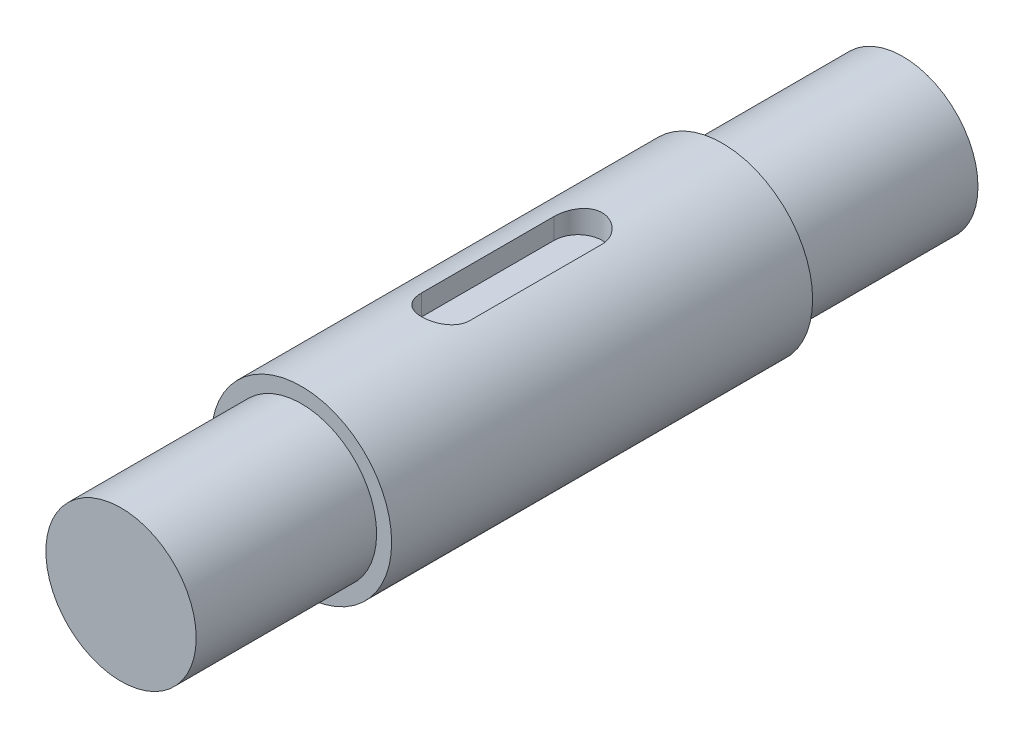
ISO-10303-21;
HEADER;
FILE_DESCRIPTION(('STEP AP214'),'2;1');
FILE_NAME('part.step','',(''),(''),'','','');
FILE_SCHEMA(('AUTOMOTIVE_DESIGN { 1 0 10303 214 1 1 1 1 }'));
ENDSEC;
DATA;
#1=APPLICATION_CONTEXT('core data for automotive mechanical design processes');
#2=APPLICATION_PROTOCOL_DEFINITION('international standard','automotive_design',2000,#1);
#3=PRODUCT_CONTEXT('',#1,'mechanical');
#4=PRODUCT('Part','Part','',(#3));
#5=PRODUCT_RELATED_PRODUCT_CATEGORY('part','',(#4));
#6=PRODUCT_DEFINITION_FORMATION('','',#4);
#7=PRODUCT_DEFINITION_CONTEXT('part definition',#1,'design');
#8=PRODUCT_DEFINITION('design','',#6,#7);
#9=PRODUCT_DEFINITION_SHAPE('','',#8);
#10=(LENGTH_UNIT() NAMED_UNIT(*) SI_UNIT(.MILLI.,.METRE.));
#11=(NAMED_UNIT(*) PLANE_ANGLE_UNIT() SI_UNIT($,.RADIAN.));
#12=(NAMED_UNIT(*) SI_UNIT($,.STERADIAN.) SOLID_ANGLE_UNIT());
#13=UNCERTAINTY_MEASURE_WITH_UNIT(LENGTH_MEASURE(1.E-05),#10,'distance_accuracy_value','');
#14=(GEOMETRIC_REPRESENTATION_CONTEXT(3) GLOBAL_UNCERTAINTY_ASSIGNED_CONTEXT((#13)) GLOBAL_UNIT_ASSIGNED_CONTEXT((#10,
#11,#12)) REPRESENTATION_CONTEXT('',''));
#15=CARTESIAN_POINT('',(0.,0.,0.));
#16=DIRECTION('',(0.,0.,1.));
#17=DIRECTION('',(1.,0.,0.));
#18=AXIS2_PLACEMENT_3D('',#15,#16,#17);
#19=CARTESIAN_POINT('',(0.,0.,91.7233580823623));
#20=DIRECTION('',(0.,0.,1.));
#21=DIRECTION('',(1.,0.,0.));
#22=AXIS2_PLACEMENT_3D('',#19,#20,#21);
#23=CYLINDRICAL_SURFACE('',#22,15.);
#24=CARTESIAN_POINT('',(0.,0.,0.));
#25=DIRECTION('',(0.,0.,1.));
#26=DIRECTION('',(1.,0.,0.));
#27=AXIS2_PLACEMENT_3D('',#24,#25,#26);
#28=CIRCLE('',#27,15.);
#29=CARTESIAN_POINT('',(15.,0.,0.));
#30=VERTEX_POINT('',#29);
#31=EDGE_CURVE('E113',#30,#30,#28,.T.);
#32=ORIENTED_EDGE('',*,*,#31,.F.);
#33=EDGE_LOOP('',(#32));
#34=FACE_BOUND('',#33,.T.);
#35=CARTESIAN_POINT('',(0.,0.,-70.));
#36=DIRECTION('',(0.,0.,1.));
#37=DIRECTION('',(1.,0.,0.));
#38=AXIS2_PLACEMENT_3D('',#35,#36,#37);
#39=CIRCLE('',#38,15.);
#40=CARTESIAN_POINT('',(15.,0.,-70.));
#41=VERTEX_POINT('',#40);
#42=EDGE_CURVE('E116',#41,#41,#39,.T.);
#43=ORIENTED_EDGE('',*,*,#42,.T.);
#44=EDGE_LOOP('',(#43));
#45=FACE_BOUND('',#44,.T.);
#46=CARTESIAN_POINT('',(-4.,14.456832294801,-24.));
#47=CARTESIAN_POINT('',(-4.00001309389174,14.4568189842467,-23.8896417565959));
#48=CARTESIAN_POINT('',(-3.99543311151603,14.4580956467717,-23.7792914780071));
#49=CARTESIAN_POINT('',(-3.97718874589725,14.4631301353517,-23.5594213460339));
#50=CARTESIAN_POINT('',(-3.96352604983923,14.4668875005959,-23.4499013422402));
#51=CARTESIAN_POINT('',(-3.92725695741262,14.4767740441058,-23.232698346486));
#52=CARTESIAN_POINT('',(-3.90466984692445,14.482898107258,-23.1250119121517));
#53=CARTESIAN_POINT('',(-3.85076543838184,14.4973231400467,-22.9120251396444));
#54=CARTESIAN_POINT('',(-3.81944798699436,14.5056241479174,-22.8067248434147));
#55=CARTESIAN_POINT('',(-3.71275643853686,14.5334412456827,-22.4955365812247));
#56=CARTESIAN_POINT('',(-3.62460332607935,14.5558829598252,-22.2941250664526));
#57=CARTESIAN_POINT('',(-3.41695780475819,14.6060171290377,-21.9089792403742));
#58=CARTESIAN_POINT('',(-3.29745504324306,14.6337113178035,-21.7252507960276));
#59=CARTESIAN_POINT('',(-3.02730320878009,14.6920016406366,-21.3760294230722));
#60=CARTESIAN_POINT('',(-2.87601544465618,14.7226489452442,-21.2110381590343));
#61=CARTESIAN_POINT('',(-2.54795832924028,14.7829523618628,-20.9084424330384));
#62=CARTESIAN_POINT('',(-2.37118484921248,14.8126083123117,-20.7708424171316));
#63=CARTESIAN_POINT('',(-1.99367199592155,14.8681604116921,-20.5248278698145));
#64=CARTESIAN_POINT('',(-1.79259414843396,14.8939887414057,-20.4169160344217));
#65=CARTESIAN_POINT('',(-1.3743557555279,14.9383834129136,-20.2366271110387));
#66=CARTESIAN_POINT('',(-1.15719869214846,14.9569513215518,-20.1642423552231));
#67=CARTESIAN_POINT('',(-0.718234307369668,14.9843709217852,-20.0586901748307));
#68=CARTESIAN_POINT('',(-0.496647293428102,14.9934353394137,-20.0246627871064));
#69=CARTESIAN_POINT('',(-0.0507319917605715,15.0015705103632,-19.994085686777));
#70=CARTESIAN_POINT('',(0.173595891963462,15.0006427191926,-19.9975305158075));
#71=CARTESIAN_POINT('',(0.612629502642179,14.9890534931376,-20.0411956863681));
#72=CARTESIAN_POINT('',(0.827435206418333,14.9786381919443,-20.0804861276563));
#73=CARTESIAN_POINT('',(1.24728467665106,14.9495347795912,-20.1932251508633));
#74=CARTESIAN_POINT('',(1.45232797980576,14.9308462762364,-20.2666753521507));
#75=CARTESIAN_POINT('',(1.84920963545356,14.8869312076945,-20.4463599662528));
#76=CARTESIAN_POINT('',(2.04089626466618,14.8616414267933,-20.5529133722298));
#77=CARTESIAN_POINT('',(2.40398441957149,14.8072486052897,-20.7955427689646));
#78=CARTESIAN_POINT('',(2.57538239000352,14.7781448982353,-20.9316239221831));
#79=CARTESIAN_POINT('',(2.89854935036781,14.7182294237973,-21.2343279711014));
#80=CARTESIAN_POINT('',(3.04955722400809,14.6873926412643,-21.4017580078943));
#81=CARTESIAN_POINT('',(3.32161448391783,14.6282716207252,-21.7600428407092));
#82=CARTESIAN_POINT('',(3.44265558078021,14.5999880903709,-21.9509040964812));
#83=CARTESIAN_POINT('',(3.59932937334134,14.5618587427771,-22.2513532833646));
#84=CARTESIAN_POINT('',(3.64754371945349,14.5498268172621,-22.354288915041));
#85=CARTESIAN_POINT('',(3.73509417643327,14.5275984074125,-22.5640463212715));
#86=CARTESIAN_POINT('',(3.77443385857864,14.5174011851057,-22.6708665124627));
#87=CARTESIAN_POINT('',(3.84386783810501,14.4991713081511,-22.8875194192202));
#88=CARTESIAN_POINT('',(3.87397173088604,14.4911364080612,-22.997348878193));
#89=CARTESIAN_POINT('',(3.92471856960775,14.4774747012191,-23.2192752211249));
#90=CARTESIAN_POINT('',(3.94536592495321,14.4718467722231,-23.33137102282));
#91=CARTESIAN_POINT('',(3.97411378733403,14.4639761334309,-23.536251024718));
#92=CARTESIAN_POINT('',(3.98382319960777,14.4613012625133,-23.6287964461673));
#93=CARTESIAN_POINT('',(3.99676420153356,14.4577275048596,-23.8142253533099));
#94=CARTESIAN_POINT('',(4.00000603663185,14.4568258092259,-23.9071080704325));
#95=CARTESIAN_POINT('',(4.00000000000001,14.456832294801,-24.));
#96=B_SPLINE_CURVE_WITH_KNOTS('',3,(#46,#47,#48,#49,#50,#51,#52,#53,#54,#55,#56,#57,#58,#59,#60,
#61,#62,#63,#64,#65,#66,#67,#68,#69,#70,#71,#72,#73,#74,#75,#76,#77,#78,#79,#80,#81,#82,#83,#84,
#85,#86,#87,#88,#89,#90,#91,#92,#93,#94,#95),.UNSPECIFIED.,.F.,.F.,(4,2,2,2,2,2,2,2,2,2,2,2,2,2,
2,2,2,2,2,2,2,2,2,2,4),(0.,0.330958670878054,0.661855880768517,0.992041890688584,
1.32223370010825,1.98190700187181,2.64179842357632,3.3164963753615,3.99130375261119,
4.67691814590524,5.36238449759351,6.03215661862343,6.7018311790669,7.35461236515046,
8.00742449996359,8.66673340793704,9.32615767867958,10.0057598785669,10.6855498604333,
11.0281077435251,11.3705275300852,11.7125903499582,12.0544935096115,12.3335333037377,
12.6121307120356),.UNSPECIFIED.);
#97=CARTESIAN_POINT('',(-4.,14.456832294801,-24.));
#98=VERTEX_POINT('',#97);
#99=CARTESIAN_POINT('',(4.00000000000001,14.456832294801,-24.));
#100=VERTEX_POINT('',#99);
#101=EDGE_CURVE('E119',#98,#100,#96,.T.);
#102=ORIENTED_EDGE('',*,*,#101,.F.);
#103=DIRECTION('',(0.,0.,1.));
#104=VECTOR('',#103,1.);
#105=CARTESIAN_POINT('',(-4.,14.456832294801,91.7233580823623));
#106=LINE('',#105,#104);
#107=CARTESIAN_POINT('',(-4.,14.456832294801,-46.));
#108=VERTEX_POINT('',#107);
#109=EDGE_CURVE('E11',#108,#98,#106,.T.);
#110=ORIENTED_EDGE('',*,*,#109,.F.);
#111=CARTESIAN_POINT('',(4.,14.456832294801,-46.));
#112=CARTESIAN_POINT('',(4.00001309389175,14.4568189842467,-46.1103582434041));
#113=CARTESIAN_POINT('',(3.99543311151604,14.4580956467717,-46.2207085219929));
#114=CARTESIAN_POINT('',(3.97718874589726,14.4631301353517,-46.4405786539661));
#115=CARTESIAN_POINT('',(3.96352604983924,14.4668875005959,-46.5500986577597));
#116=CARTESIAN_POINT('',(3.92725695741263,14.4767740441058,-46.767301653514));
#117=CARTESIAN_POINT('',(3.90466984692446,14.482898107258,-46.8749880878483));
#118=CARTESIAN_POINT('',(3.85076543838184,14.4973231400467,-47.0879748603556));
#119=CARTESIAN_POINT('',(3.81944798699437,14.5056241479174,-47.1932751565853));
#120=CARTESIAN_POINT('',(3.71275643853687,14.5334412456827,-47.5044634187753));
#121=CARTESIAN_POINT('',(3.62460332607936,14.5558829598252,-47.7058749335474));
#122=CARTESIAN_POINT('',(3.41695780475821,14.6060171290377,-48.0910207596257));
#123=CARTESIAN_POINT('',(3.29745504324307,14.6337113178035,-48.2747492039724));
#124=CARTESIAN_POINT('',(3.0273032087801,14.6920016406366,-48.6239705769278));
#125=CARTESIAN_POINT('',(2.87601544465619,14.7226489452442,-48.7889618409657));
#126=CARTESIAN_POINT('',(2.54795832924029,14.7829523618628,-49.0915575669616));
#127=CARTESIAN_POINT('',(2.37118484921249,14.8126083123117,-49.2291575828684));
#128=CARTESIAN_POINT('',(1.99367199592156,14.8681604116921,-49.4751721301854));
#129=CARTESIAN_POINT('',(1.79259414843396,14.8939887414057,-49.5830839655783));
#130=CARTESIAN_POINT('',(1.37435575552791,14.9383834129136,-49.7633728889612));
#131=CARTESIAN_POINT('',(1.15719869214847,14.9569513215518,-49.8357576447769));
#132=CARTESIAN_POINT('',(0.718234307369679,14.9843709217852,-49.9413098251693));
#133=CARTESIAN_POINT('',(0.496647293428114,14.9934353394137,-49.9753372128936));
#134=CARTESIAN_POINT('',(0.0507319917605842,15.0015705103632,-50.005914313223));
#135=CARTESIAN_POINT('',(-0.173595891963449,15.0006427191926,-50.0024694841925));
#136=CARTESIAN_POINT('',(-0.612629502642165,14.9890534931376,-49.9588043136319));
#137=CARTESIAN_POINT('',(-0.827435206418319,14.9786381919443,-49.9195138723437));
#138=CARTESIAN_POINT('',(-1.24728467665104,14.9495347795912,-49.8067748491367));
#139=CARTESIAN_POINT('',(-1.45232797980575,14.9308462762364,-49.7333246478493));
#140=CARTESIAN_POINT('',(-1.84920963545355,14.8869312076945,-49.5536400337472));
#141=CARTESIAN_POINT('',(-2.04089626466617,14.8616414267933,-49.4470866277702));
#142=CARTESIAN_POINT('',(-2.40398441957148,14.8072486052897,-49.2044572310354));
#143=CARTESIAN_POINT('',(-2.5753823900035,14.7781448982353,-49.0683760778169));
#144=CARTESIAN_POINT('',(-2.8985493503678,14.7182294237973,-48.7656720288986));
#145=CARTESIAN_POINT('',(-3.04955722400808,14.6873926412643,-48.5982419921057));
#146=CARTESIAN_POINT('',(-3.32161448391782,14.6282716207252,-48.2399571592908));
#147=CARTESIAN_POINT('',(-3.4426555807802,14.5999880903709,-48.0490959035188));
#148=CARTESIAN_POINT('',(-3.59932937334133,14.5618587427771,-47.7486467166354));
#149=CARTESIAN_POINT('',(-3.64754371945347,14.5498268172621,-47.645711084959));
#150=CARTESIAN_POINT('',(-3.73509417643326,14.5275984074125,-47.4359536787286));
#151=CARTESIAN_POINT('',(-3.77443385857863,14.5174011851057,-47.3291334875373));
#152=CARTESIAN_POINT('',(-3.843867838105,14.4991713081511,-47.1124805807798));
#153=CARTESIAN_POINT('',(-3.87397173088603,14.4911364080612,-47.002651121807));
#154=CARTESIAN_POINT('',(-3.92471856960774,14.4774747012191,-46.780724778875));
#155=CARTESIAN_POINT('',(-3.94536592495319,14.4718467722231,-46.66862897718));
#156=CARTESIAN_POINT('',(-3.97411378733402,14.4639761334309,-46.463748975282));
#157=CARTESIAN_POINT('',(-3.98382319960776,14.4613012625133,-46.3712035538327));
#158=CARTESIAN_POINT('',(-3.99676420153355,14.4577275048596,-46.1857746466901));
#159=CARTESIAN_POINT('',(-4.00000603663183,14.4568258092259,-46.0928919295675));
#160=CARTESIAN_POINT('',(-3.99999999999999,14.456832294801,-46.));
#161=B_SPLINE_CURVE_WITH_KNOTS('',3,(#111,#112,#113,#114,#115,#116,#117,#118,#119,#120,#121,
#122,#123,#124,#125,#126,#127,#128,#129,#130,#131,#132,#133,#134,#135,#136,#137,#138,#139,#140,
#141,#142,#143,#144,#145,#146,#147,#148,#149,#150,#151,#152,#153,#154,#155,#156,#157,#158,#159,
#160),.UNSPECIFIED.,.F.,.F.,(4,2,2,2,2,2,2,2,2,2,2,2,2,2,2,2,2,2,2,2,2,2,2,2,4),(0.,
0.330958670878051,0.661855880768517,0.992041890688588,1.32223370010825,1.9819070018718,
2.64179842357631,3.31649637536149,3.99130375261118,4.67691814590523,5.3623844975935,
6.03215661862343,6.70183117906689,7.35461236515045,8.00742449996358,8.66673340793703,
9.32615767867957,10.0057598785669,10.6855498604333,11.0281077435251,11.3705275300852,
11.7125903499581,12.0544935096114,12.3335333037377,12.6121307120356),.UNSPECIFIED.);
#162=CARTESIAN_POINT('',(4.,14.456832294801,-46.));
#163=VERTEX_POINT('',#162);
#164=EDGE_CURVE('E55',#163,#108,#161,.T.);
#165=ORIENTED_EDGE('',*,*,#164,.F.);
#166=DIRECTION('',(0.,0.,1.));
#167=VECTOR('',#166,1.);
#168=CARTESIAN_POINT('',(4.00000000000004,14.456832294801,91.7233580823623));
#169=LINE('',#168,#167);
#170=EDGE_CURVE('E40',#100,#163,#169,.F.);
#171=ORIENTED_EDGE('',*,*,#170,.F.);
#172=EDGE_LOOP('',(#102,#110,#165,#171));
#173=FACE_BOUND('',#172,.T.);
#174=ADVANCED_FACE('F32',(#34,#45,#173),#23,.T.);
#175=CARTESIAN_POINT('',(0.,15.,-70.));
#176=DIRECTION('',(0.,0.,1.));
#177=DIRECTION('',(1.,0.,0.));
#178=AXIS2_PLACEMENT_3D('',#175,#176,#177);
#179=PLANE('',#178);
#180=ORIENTED_EDGE('',*,*,#42,.F.);
#181=EDGE_LOOP('',(#180));
#182=FACE_BOUND('',#181,.T.);
#183=CARTESIAN_POINT('',(0.,0.,-70.));
#184=DIRECTION('',(0.,0.,1.));
#185=DIRECTION('',(1.,0.,0.));
#186=AXIS2_PLACEMENT_3D('',#183,#184,#185);
#187=CIRCLE('',#186,12.5);
#188=CARTESIAN_POINT('',(12.5,0.,-70.));
#189=VERTEX_POINT('',#188);
#190=EDGE_CURVE('E79',#189,#189,#187,.T.);
#191=ORIENTED_EDGE('',*,*,#190,.T.);
#192=EDGE_LOOP('',(#191));
#193=FACE_BOUND('',#192,.T.);
#194=ADVANCED_FACE('F34',(#182,#193),#179,.F.);
#195=CARTESIAN_POINT('',(0.,12.5,0.));
#196=DIRECTION('',(0.,0.,-1.));
#197=DIRECTION('',(-1.,0.,0.));
#198=AXIS2_PLACEMENT_3D('',#195,#196,#197);
#199=PLANE('',#198);
#200=CARTESIAN_POINT('',(0.,0.,0.));
#201=DIRECTION('',(0.,0.,1.));
#202=DIRECTION('',(1.,0.,0.));
#203=AXIS2_PLACEMENT_3D('',#200,#201,#202);
#204=CIRCLE('',#203,12.5);
#205=CARTESIAN_POINT('',(12.5,0.,0.));
#206=VERTEX_POINT('',#205);
#207=EDGE_CURVE('E110',#206,#206,#204,.T.);
#208=ORIENTED_EDGE('',*,*,#207,.F.);
#209=EDGE_LOOP('',(#208));
#210=FACE_BOUND('',#209,.T.);
#211=ORIENTED_EDGE('',*,*,#31,.T.);
#212=EDGE_LOOP('',(#211));
#213=FACE_BOUND('',#212,.T.);
#214=ADVANCED_FACE('F157',(#210,#213),#199,.F.);
#215=CARTESIAN_POINT('',(0.,0.,91.7233580823623));
#216=DIRECTION('',(0.,0.,1.));
#217=DIRECTION('',(1.,0.,0.));
#218=AXIS2_PLACEMENT_3D('',#215,#216,#217);
#219=CYLINDRICAL_SURFACE('',#218,12.5);
#220=CARTESIAN_POINT('',(0.,0.,30.));
#221=DIRECTION('',(0.,0.,1.));
#222=DIRECTION('',(1.,0.,0.));
#223=AXIS2_PLACEMENT_3D('',#220,#221,#222);
#224=CIRCLE('',#223,12.5);
#225=CARTESIAN_POINT('',(12.5,0.,30.));
#226=VERTEX_POINT('',#225);
#227=EDGE_CURVE('E107',#226,#226,#224,.T.);
#228=ORIENTED_EDGE('',*,*,#227,.F.);
#229=EDGE_LOOP('',(#228));
#230=FACE_BOUND('',#229,.T.);
#231=ORIENTED_EDGE('',*,*,#207,.T.);
#232=EDGE_LOOP('',(#231));
#233=FACE_BOUND('',#232,.T.);
#234=ADVANCED_FACE('F154',(#230,#233),#219,.T.);
#235=CARTESIAN_POINT('',(0.,12.5,30.));
#236=DIRECTION('',(0.,0.,-1.));
#237=DIRECTION('',(-1.,0.,0.));
#238=AXIS2_PLACEMENT_3D('',#235,#236,#237);
#239=PLANE('',#238);
#240=ORIENTED_EDGE('',*,*,#227,.T.);
#241=EDGE_LOOP('',(#240));
#242=FACE_BOUND('',#241,.T.);
#243=ADVANCED_FACE('F150',(#242),#239,.F.);
#244=CARTESIAN_POINT('',(0.,0.,-100.));
#245=DIRECTION('',(0.,0.,1.));
#246=DIRECTION('',(1.,0.,0.));
#247=AXIS2_PLACEMENT_3D('',#244,#245,#246);
#248=PLANE('',#247);
#249=CARTESIAN_POINT('',(0.,0.,-100.));
#250=DIRECTION('',(0.,0.,1.));
#251=DIRECTION('',(1.,0.,0.));
#252=AXIS2_PLACEMENT_3D('',#249,#250,#251);
#253=CIRCLE('',#252,12.5);
#254=CARTESIAN_POINT('',(12.5,0.,-100.));
#255=VERTEX_POINT('',#254);
#256=EDGE_CURVE('E104',#255,#255,#253,.T.);
#257=ORIENTED_EDGE('',*,*,#256,.F.);
#258=EDGE_LOOP('',(#257));
#259=FACE_BOUND('',#258,.T.);
#260=ADVANCED_FACE('F146',(#259),#248,.F.);
#261=CARTESIAN_POINT('',(0.,0.,91.7233580823623));
#262=DIRECTION('',(0.,0.,1.));
#263=DIRECTION('',(1.,0.,0.));
#264=AXIS2_PLACEMENT_3D('',#261,#262,#263);
#265=CYLINDRICAL_SURFACE('',#264,12.5);
#266=ORIENTED_EDGE('',*,*,#190,.F.);
#267=EDGE_LOOP('',(#266));
#268=FACE_BOUND('',#267,.T.);
#269=ORIENTED_EDGE('',*,*,#256,.T.);
#270=EDGE_LOOP('',(#269));
#271=FACE_BOUND('',#270,.T.);
#272=ADVANCED_FACE('F143',(#268,#271),#265,.T.);
#273=CARTESIAN_POINT('',(0.,15.,-46.));
#274=DIRECTION('',(0.,-1.,0.));
#275=DIRECTION('',(0.,0.,-1.));
#276=AXIS2_PLACEMENT_3D('',#273,#274,#275);
#277=CYLINDRICAL_SURFACE('',#276,4.);
#278=DIRECTION('',(0.,-1.,0.));
#279=VECTOR('',#278,1.);
#280=CARTESIAN_POINT('',(4.,15.,-46.));
#281=LINE('',#280,#279);
#282=CARTESIAN_POINT('',(4.,11.,-46.));
#283=VERTEX_POINT('',#282);
#284=EDGE_CURVE('E98',#163,#283,#281,.T.);
#285=ORIENTED_EDGE('',*,*,#284,.F.);
#286=ORIENTED_EDGE('',*,*,#164,.T.);
#287=DIRECTION('',(0.,-1.,0.));
#288=VECTOR('',#287,1.);
#289=CARTESIAN_POINT('',(-4.,15.,-46.));
#290=LINE('',#289,#288);
#291=CARTESIAN_POINT('',(-4.,11.,-46.));
#292=VERTEX_POINT('',#291);
#293=EDGE_CURVE('E72',#108,#292,#290,.T.);
#294=ORIENTED_EDGE('',*,*,#293,.T.);
#295=CARTESIAN_POINT('',(0.,11.,-46.));
#296=DIRECTION('',(0.,1.,0.));
#297=DIRECTION('',(0.,0.,1.));
#298=AXIS2_PLACEMENT_3D('',#295,#296,#297);
#299=CIRCLE('',#298,4.);
#300=EDGE_CURVE('E76',#283,#292,#299,.T.);
#301=ORIENTED_EDGE('',*,*,#300,.F.);
#302=EDGE_LOOP('',(#285,#286,#294,#301));
#303=FACE_BOUND('',#302,.T.);
#304=ADVANCED_FACE('F74',(#303),#277,.F.);
#305=CARTESIAN_POINT('',(-4.,15.,-46.));
#306=DIRECTION('',(1.,0.,0.));
#307=DIRECTION('',(0.,0.,-1.));
#308=AXIS2_PLACEMENT_3D('',#305,#306,#307);
#309=PLANE('',#308);
#310=ORIENTED_EDGE('',*,*,#109,.T.);
#311=DIRECTION('',(0.,-1.,0.));
#312=VECTOR('',#311,1.);
#313=CARTESIAN_POINT('',(-4.,15.,-24.));
#314=LINE('',#313,#312);
#315=CARTESIAN_POINT('',(-4.,11.,-24.));
#316=VERTEX_POINT('',#315);
#317=EDGE_CURVE('E80',#98,#316,#314,.T.);
#318=ORIENTED_EDGE('',*,*,#317,.T.);
#319=DIRECTION('',(0.,0.,1.));
#320=VECTOR('',#319,1.);
#321=CARTESIAN_POINT('',(-4.,11.,-46.));
#322=LINE('',#321,#320);
#323=EDGE_CURVE('E83',#292,#316,#322,.T.);
#324=ORIENTED_EDGE('',*,*,#323,.F.);
#325=ORIENTED_EDGE('',*,*,#293,.F.);
#326=EDGE_LOOP('',(#310,#318,#324,#325));
#327=FACE_BOUND('',#326,.T.);
#328=ADVANCED_FACE('F84',(#327),#309,.T.);
#329=CARTESIAN_POINT('',(0.,15.,-24.));
#330=DIRECTION('',(0.,-1.,0.));
#331=DIRECTION('',(0.,0.,-1.));
#332=AXIS2_PLACEMENT_3D('',#329,#330,#331);
#333=CYLINDRICAL_SURFACE('',#332,4.);
#334=ORIENTED_EDGE('',*,*,#317,.F.);
#335=ORIENTED_EDGE('',*,*,#101,.T.);
#336=DIRECTION('',(0.,-1.,0.));
#337=VECTOR('',#336,1.);
#338=CARTESIAN_POINT('',(4.00000000000001,15.,-24.));
#339=LINE('',#338,#337);
#340=CARTESIAN_POINT('',(4.00000000000001,11.,-24.));
#341=VERTEX_POINT('',#340);
#342=EDGE_CURVE('E47',#100,#341,#339,.T.);
#343=ORIENTED_EDGE('',*,*,#342,.T.);
#344=CARTESIAN_POINT('',(0.,11.,-24.));
#345=DIRECTION('',(0.,1.,0.));
#346=DIRECTION('',(0.,0.,1.));
#347=AXIS2_PLACEMENT_3D('',#344,#345,#346);
#348=CIRCLE('',#347,4.);
#349=EDGE_CURVE('E89',#316,#341,#348,.T.);
#350=ORIENTED_EDGE('',*,*,#349,.F.);
#351=EDGE_LOOP('',(#334,#335,#343,#350));
#352=FACE_BOUND('',#351,.T.);
#353=ADVANCED_FACE('F131',(#352),#333,.F.);
#354=CARTESIAN_POINT('',(4.,15.,-46.));
#355=DIRECTION('',(-1.,0.,0.));
#356=DIRECTION('',(0.,0.,1.));
#357=AXIS2_PLACEMENT_3D('',#354,#355,#356);
#358=PLANE('',#357);
#359=ORIENTED_EDGE('',*,*,#170,.T.);
#360=ORIENTED_EDGE('',*,*,#284,.T.);
#361=DIRECTION('',(0.,0.,-1.));
#362=VECTOR('',#361,1.);
#363=CARTESIAN_POINT('',(4.,11.,-46.));
#364=LINE('',#363,#362);
#365=EDGE_CURVE('E93',#341,#283,#364,.T.);
#366=ORIENTED_EDGE('',*,*,#365,.F.);
#367=ORIENTED_EDGE('',*,*,#342,.F.);
#368=EDGE_LOOP('',(#359,#360,#366,#367));
#369=FACE_BOUND('',#368,.T.);
#370=ADVANCED_FACE('F136',(#369),#358,.T.);
#371=CARTESIAN_POINT('',(0.,11.,-46.));
#372=DIRECTION('',(0.,1.,0.));
#373=DIRECTION('',(0.,0.,1.));
#374=AXIS2_PLACEMENT_3D('',#371,#372,#373);
#375=PLANE('',#374);
#376=ORIENTED_EDGE('',*,*,#300,.T.);
#377=ORIENTED_EDGE('',*,*,#323,.T.);
#378=ORIENTED_EDGE('',*,*,#349,.T.);
#379=ORIENTED_EDGE('',*,*,#365,.T.);
#380=EDGE_LOOP('',(#376,#377,#378,#379));
#381=FACE_BOUND('',#380,.T.);
#382=ADVANCED_FACE('F92',(#381),#375,.T.);
#383=CLOSED_SHELL('',(#174,#194,#214,#234,#243,#260,#272,#304,#328,#353,#370,#382));
#384=MANIFOLD_SOLID_BREP('B2',#383);
#385=ADVANCED_BREP_SHAPE_REPRESENTATION('',(#18,#384),#14);
#386=SHAPE_DEFINITION_REPRESENTATION(#9,#385);
ENDSEC;
END-ISO-10303-21;
